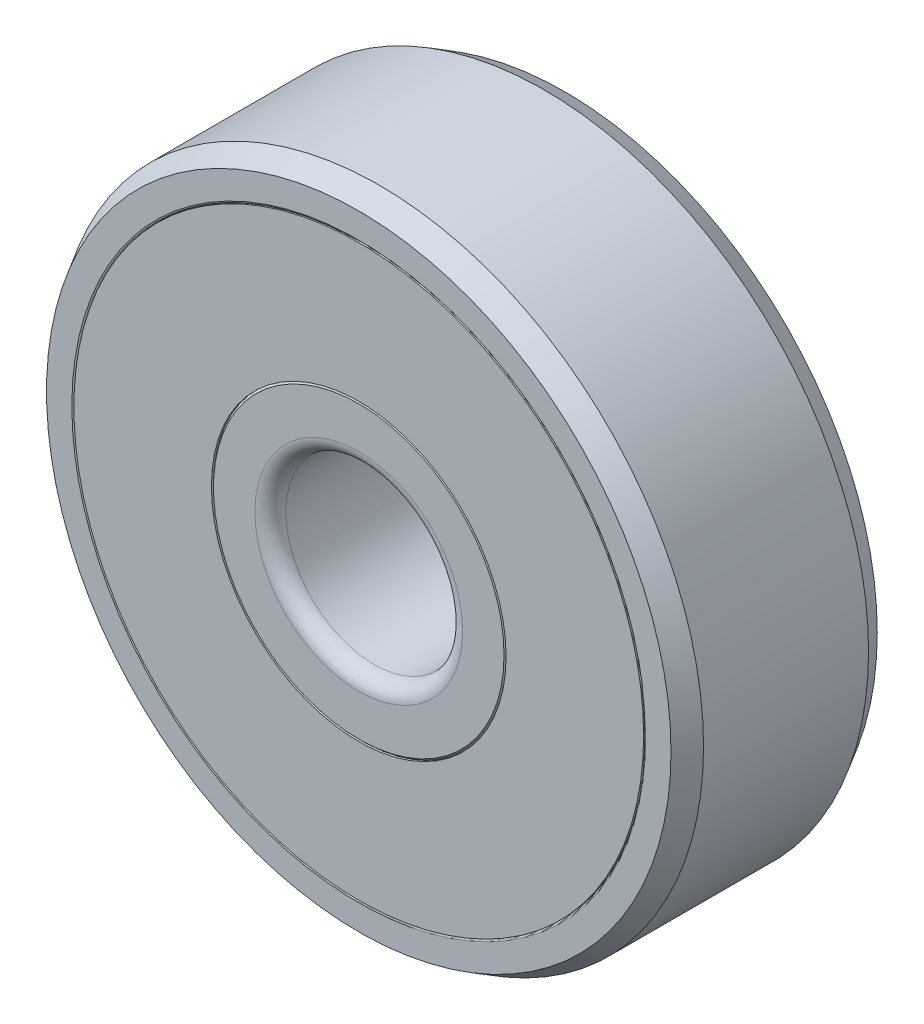
ISO-10303-21;
HEADER;
FILE_DESCRIPTION(('STEP AP214'),'2;1');
FILE_NAME('part.step','',(''),(''),'','','');
FILE_SCHEMA(('AUTOMOTIVE_DESIGN { 1 0 10303 214 1 1 1 1 }'));
ENDSEC;
DATA;
#1=APPLICATION_CONTEXT('core data for automotive mechanical design processes');
#2=APPLICATION_PROTOCOL_DEFINITION('international standard','automotive_design',2000,#1);
#3=PRODUCT_CONTEXT('',#1,'mechanical');
#4=PRODUCT('Part','Part','',(#3));
#5=PRODUCT_RELATED_PRODUCT_CATEGORY('part','',(#4));
#6=PRODUCT_DEFINITION_FORMATION('','',#4);
#7=PRODUCT_DEFINITION_CONTEXT('part definition',#1,'design');
#8=PRODUCT_DEFINITION('design','',#6,#7);
#9=PRODUCT_DEFINITION_SHAPE('','',#8);
#10=(LENGTH_UNIT() NAMED_UNIT(*) SI_UNIT(.MILLI.,.METRE.));
#11=(NAMED_UNIT(*) PLANE_ANGLE_UNIT() SI_UNIT($,.RADIAN.));
#12=(NAMED_UNIT(*) SI_UNIT($,.STERADIAN.) SOLID_ANGLE_UNIT());
#13=UNCERTAINTY_MEASURE_WITH_UNIT(LENGTH_MEASURE(1.E-05),#10,'distance_accuracy_value','');
#14=(GEOMETRIC_REPRESENTATION_CONTEXT(3) GLOBAL_UNCERTAINTY_ASSIGNED_CONTEXT((#13)) GLOBAL_UNIT_ASSIGNED_CONTEXT((#10,
#11,#12)) REPRESENTATION_CONTEXT('',''));
#15=CARTESIAN_POINT('',(0.,0.,0.));
#16=DIRECTION('',(0.,0.,1.));
#17=DIRECTION('',(1.,0.,0.));
#18=AXIS2_PLACEMENT_3D('',#15,#16,#17);
#19=CARTESIAN_POINT('',(5.73343087143216,-4.57225854696412,0.));
#20=DIRECTION('',(-0.781831482468022,0.623489801858743,0.));
#21=DIRECTION('',(0.,0.,1.));
#22=AXIS2_PLACEMENT_3D('',#19,#20,#21);
#23=SPHERICAL_SURFACE('',#22,3.22222222222222);
#24=CARTESIAN_POINT('',(3.21419609459076,-2.56323585208594,0.));
#25=VERTEX_POINT('',#24);
#26=VERTEX_LOOP('',#25);
#27=FACE_BOUND('',#26,.T.);
#28=ADVANCED_FACE('F41',(#27),#23,.T.);
#29=CLOSED_SHELL('',(#28));
#30=MANIFOLD_SOLID_BREP('B2',#29);
#31=CARTESIAN_POINT('',(7.14947135600005,1.63182018234624,0.));
#32=DIRECTION('',(-0.974927912181826,-0.222520933956305,0.));
#33=DIRECTION('',(0.,0.,1.));
#34=AXIS2_PLACEMENT_3D('',#31,#32,#33);
#35=SPHERICAL_SURFACE('',#34,3.22222222222222);
#36=CARTESIAN_POINT('',(4.00803697230306,0.914808284042587,0.));
#37=VERTEX_POINT('',#36);
#38=VERTEX_LOOP('',#37);
#39=FACE_BOUND('',#38,.T.);
#40=ADVANCED_FACE('F61',(#39),#35,.T.);
#41=CLOSED_SHELL('',(#40));
#42=MANIFOLD_SOLID_BREP('B6',#41);
#43=CARTESIAN_POINT('',(3.18181408686214,6.60710503128438,0.));
#44=DIRECTION('',(-0.433883739117565,-0.900968867902416,0.));
#45=DIRECTION('',(0.,0.,1.));
#46=AXIS2_PLACEMENT_3D('',#43,#44,#45);
#47=SPHERICAL_SURFACE('',#46,3.22222222222222);
#48=CARTESIAN_POINT('',(1.78374426081666,3.70398312359882,0.));
#49=VERTEX_POINT('',#48);
#50=VERTEX_LOOP('',#49);
#51=FACE_BOUND('',#50,.T.);
#52=ADVANCED_FACE('F81',(#51),#47,.T.);
#53=CLOSED_SHELL('',(#52));
#54=MANIFOLD_SOLID_BREP('B37',#53);
#55=CARTESIAN_POINT('',(-3.18181408686205,6.60710503128443,0.));
#56=DIRECTION('',(0.433883739117553,-0.900968867902422,0.));
#57=DIRECTION('',(0.,0.,1.));
#58=AXIS2_PLACEMENT_3D('',#55,#56,#57);
#59=SPHERICAL_SURFACE('',#58,3.22222222222222);
#60=CARTESIAN_POINT('',(-1.7837442608166,3.70398312359884,0.));
#61=VERTEX_POINT('',#60);
#62=VERTEX_LOOP('',#61);
#63=FACE_BOUND('',#62,.T.);
#64=ADVANCED_FACE('F101',(#63),#59,.T.);
#65=CLOSED_SHELL('',(#64));
#66=MANIFOLD_SOLID_BREP('B57',#65);
#67=CARTESIAN_POINT('',(-7.14947135600003,1.63182018234633,0.));
#68=DIRECTION('',(0.974927912181823,-0.222520933956318,0.));
#69=DIRECTION('',(0.,0.,1.));
#70=AXIS2_PLACEMENT_3D('',#67,#68,#69);
#71=SPHERICAL_SURFACE('',#70,3.22222222222222);
#72=CARTESIAN_POINT('',(-4.00803697230305,0.914808284042641,0.));
#73=VERTEX_POINT('',#72);
#74=VERTEX_LOOP('',#73);
#75=FACE_BOUND('',#74,.T.);
#76=ADVANCED_FACE('F121',(#75),#71,.T.);
#77=CLOSED_SHELL('',(#76));
#78=MANIFOLD_SOLID_BREP('B77',#77);
#79=CARTESIAN_POINT('',(-5.73343087143223,-4.57225854696403,0.));
#80=DIRECTION('',(0.781831482468031,0.623489801858732,0.));
#81=DIRECTION('',(0.,0.,1.));
#82=AXIS2_PLACEMENT_3D('',#79,#80,#81);
#83=SPHERICAL_SURFACE('',#82,3.22222222222222);
#84=CARTESIAN_POINT('',(-3.21419609459079,-2.5632358520859,0.));
#85=VERTEX_POINT('',#84);
#86=VERTEX_LOOP('',#85);
#87=FACE_BOUND('',#86,.T.);
#88=ADVANCED_FACE('F141',(#87),#83,.T.);
#89=CLOSED_SHELL('',(#88));
#90=MANIFOLD_SOLID_BREP('B97',#89);
#91=CARTESIAN_POINT('',(0.,-7.33333333333333,0.));
#92=DIRECTION('',(0.,1.,0.));
#93=DIRECTION('',(0.,0.,1.));
#94=AXIS2_PLACEMENT_3D('',#91,#92,#93);
#95=SPHERICAL_SURFACE('',#94,3.22222222222222);
#96=CARTESIAN_POINT('',(0.,-4.11111111111111,0.));
#97=VERTEX_POINT('',#96);
#98=VERTEX_LOOP('',#97);
#99=FACE_BOUND('',#98,.T.);
#100=ADVANCED_FACE('F163',(#99),#95,.T.);
#101=CLOSED_SHELL('',(#100));
#102=MANIFOLD_SOLID_BREP('B117',#101);
#103=CARTESIAN_POINT('',(0.,-5.,3.5));
#104=DIRECTION('',(0.,0.,1.));
#105=DIRECTION('',(1.,0.,0.));
#106=AXIS2_PLACEMENT_3D('',#103,#104,#105);
#107=PLANE('',#106);
#108=CARTESIAN_POINT('',(0.,0.,3.5));
#109=DIRECTION('',(0.,0.,1.));
#110=DIRECTION('',(1.,0.,0.));
#111=AXIS2_PLACEMENT_3D('',#108,#109,#110);
#112=CIRCLE('',#111,9.66666666666667);
#113=CARTESIAN_POINT('',(9.66666666666667,0.,3.5));
#114=VERTEX_POINT('',#113);
#115=EDGE_CURVE('E162',#114,#114,#112,.T.);
#116=ORIENTED_EDGE('',*,*,#115,.T.);
#117=EDGE_LOOP('',(#116));
#118=FACE_BOUND('',#117,.T.);
#119=CARTESIAN_POINT('',(0.,0.,3.5));
#120=DIRECTION('',(0.,0.,1.));
#121=DIRECTION('',(1.,0.,0.));
#122=AXIS2_PLACEMENT_3D('',#119,#120,#121);
#123=CIRCLE('',#122,5.);
#124=CARTESIAN_POINT('',(5.,0.,3.5));
#125=VERTEX_POINT('',#124);
#126=EDGE_CURVE('E199',#125,#125,#123,.T.);
#127=ORIENTED_EDGE('',*,*,#126,.F.);
#128=EDGE_LOOP('',(#127));
#129=FACE_BOUND('',#128,.T.);
#130=ADVANCED_FACE('F185',(#118,#129),#107,.T.);
#131=CARTESIAN_POINT('',(0.,0.,3.5));
#132=DIRECTION('',(0.,0.,1.));
#133=DIRECTION('',(1.,0.,0.));
#134=AXIS2_PLACEMENT_3D('',#131,#132,#133);
#135=CYLINDRICAL_SURFACE('',#134,9.66666666666667);
#136=CARTESIAN_POINT('',(0.,0.,3.29166666666667));
#137=DIRECTION('',(0.,0.,1.));
#138=DIRECTION('',(1.,0.,0.));
#139=AXIS2_PLACEMENT_3D('',#136,#137,#138);
#140=CIRCLE('',#139,9.66666666666667);
#141=CARTESIAN_POINT('',(9.66666666666667,0.,3.29166666666667));
#142=VERTEX_POINT('',#141);
#143=EDGE_CURVE('E191',#142,#142,#140,.T.);
#144=ORIENTED_EDGE('',*,*,#143,.T.);
#145=EDGE_LOOP('',(#144));
#146=FACE_BOUND('',#145,.T.);
#147=ORIENTED_EDGE('',*,*,#115,.F.);
#148=EDGE_LOOP('',(#147));
#149=FACE_BOUND('',#148,.T.);
#150=ADVANCED_FACE('F209',(#146,#149),#135,.T.);
#151=CARTESIAN_POINT('',(0.,-5.,3.29166666666667));
#152=DIRECTION('',(0.,0.,-1.));
#153=DIRECTION('',(-1.,0.,0.));
#154=AXIS2_PLACEMENT_3D('',#151,#152,#153);
#155=PLANE('',#154);
#156=CARTESIAN_POINT('',(0.,0.,3.29166666666667));
#157=DIRECTION('',(0.,0.,1.));
#158=DIRECTION('',(1.,0.,0.));
#159=AXIS2_PLACEMENT_3D('',#156,#157,#158);
#160=CIRCLE('',#159,5.);
#161=CARTESIAN_POINT('',(5.,0.,3.29166666666667));
#162=VERTEX_POINT('',#161);
#163=EDGE_CURVE('E195',#162,#162,#160,.T.);
#164=ORIENTED_EDGE('',*,*,#163,.T.);
#165=EDGE_LOOP('',(#164));
#166=FACE_BOUND('',#165,.T.);
#167=ORIENTED_EDGE('',*,*,#143,.F.);
#168=EDGE_LOOP('',(#167));
#169=FACE_BOUND('',#168,.T.);
#170=ADVANCED_FACE('F213',(#166,#169),#155,.T.);
#171=CARTESIAN_POINT('',(0.,0.,3.5));
#172=DIRECTION('',(0.,0.,1.));
#173=DIRECTION('',(1.,0.,0.));
#174=AXIS2_PLACEMENT_3D('',#171,#172,#173);
#175=CYLINDRICAL_SURFACE('',#174,5.);
#176=ORIENTED_EDGE('',*,*,#126,.T.);
#177=EDGE_LOOP('',(#176));
#178=FACE_BOUND('',#177,.T.);
#179=ORIENTED_EDGE('',*,*,#163,.F.);
#180=EDGE_LOOP('',(#179));
#181=FACE_BOUND('',#180,.T.);
#182=ADVANCED_FACE('F205',(#178,#181),#175,.F.);
#183=CLOSED_SHELL('',(#130,#150,#170,#182));
#184=MANIFOLD_SOLID_BREP('B137',#183);
#185=CARTESIAN_POINT('',(0.,0.,2.975));
#186=DIRECTION('',(0.,0.,1.));
#187=DIRECTION('',(1.,0.,0.));
#188=AXIS2_PLACEMENT_3D('',#185,#186,#187);
#189=TOROIDAL_SURFACE('',#188,3.525,0.524999999999999);
#190=CARTESIAN_POINT('',(0.,0.,3.5));
#191=DIRECTION('',(0.,0.,1.));
#192=DIRECTION('',(1.,0.,0.));
#193=AXIS2_PLACEMENT_3D('',#190,#191,#192);
#194=CIRCLE('',#193,3.525);
#195=CARTESIAN_POINT('',(3.525,0.,3.5));
#196=VERTEX_POINT('',#195);
#197=EDGE_CURVE('E184',#196,#196,#194,.T.);
#198=ORIENTED_EDGE('',*,*,#197,.T.);
#199=EDGE_LOOP('',(#198));
#200=FACE_BOUND('',#199,.T.);
#201=CARTESIAN_POINT('',(0.,0.,2.975));
#202=DIRECTION('',(0.,0.,1.));
#203=DIRECTION('',(1.,0.,0.));
#204=AXIS2_PLACEMENT_3D('',#201,#202,#203);
#205=CIRCLE('',#204,3.);
#206=CARTESIAN_POINT('',(3.,0.,2.975));
#207=VERTEX_POINT('',#206);
#208=EDGE_CURVE('E295',#207,#207,#205,.T.);
#209=ORIENTED_EDGE('',*,*,#208,.F.);
#210=EDGE_LOOP('',(#209));
#211=FACE_BOUND('',#210,.T.);
#212=ADVANCED_FACE('F261',(#200,#211),#189,.T.);
#213=CARTESIAN_POINT('',(0.,-4.93,3.5));
#214=DIRECTION('',(0.,0.,1.));
#215=DIRECTION('',(1.,0.,0.));
#216=AXIS2_PLACEMENT_3D('',#213,#214,#215);
#217=PLANE('',#216);
#218=CARTESIAN_POINT('',(0.,0.,3.5));
#219=DIRECTION('',(0.,0.,1.));
#220=DIRECTION('',(1.,0.,0.));
#221=AXIS2_PLACEMENT_3D('',#218,#219,#220);
#222=CIRCLE('',#221,4.93);
#223=CARTESIAN_POINT('',(4.93,0.,3.5));
#224=VERTEX_POINT('',#223);
#225=EDGE_CURVE('E267',#224,#224,#222,.T.);
#226=ORIENTED_EDGE('',*,*,#225,.T.);
#227=EDGE_LOOP('',(#226));
#228=FACE_BOUND('',#227,.T.);
#229=ORIENTED_EDGE('',*,*,#197,.F.);
#230=EDGE_LOOP('',(#229));
#231=FACE_BOUND('',#230,.T.);
#232=ADVANCED_FACE('F303',(#228,#231),#217,.T.);
#233=CARTESIAN_POINT('',(0.,0.,3.5));
#234=DIRECTION('',(0.,0.,-1.));
#235=DIRECTION('',(-1.,0.,0.));
#236=AXIS2_PLACEMENT_3D('',#233,#234,#235);
#237=CONICAL_SURFACE('',#236,4.93,0.785398163397454);
#238=CARTESIAN_POINT('',(0.,0.,3.43));
#239=DIRECTION('',(0.,0.,1.));
#240=DIRECTION('',(1.,0.,0.));
#241=AXIS2_PLACEMENT_3D('',#238,#239,#240);
#242=CIRCLE('',#241,5.);
#243=CARTESIAN_POINT('',(5.,0.,3.43));
#244=VERTEX_POINT('',#243);
#245=EDGE_CURVE('E271',#244,#244,#242,.T.);
#246=ORIENTED_EDGE('',*,*,#245,.T.);
#247=EDGE_LOOP('',(#246));
#248=FACE_BOUND('',#247,.T.);
#249=ORIENTED_EDGE('',*,*,#225,.F.);
#250=EDGE_LOOP('',(#249));
#251=FACE_BOUND('',#250,.T.);
#252=ADVANCED_FACE('F307',(#248,#251),#237,.T.);
#253=CARTESIAN_POINT('',(0.,0.,3.5));
#254=DIRECTION('',(0.,0.,1.));
#255=DIRECTION('',(1.,0.,0.));
#256=AXIS2_PLACEMENT_3D('',#253,#254,#255);
#257=CYLINDRICAL_SURFACE('',#256,5.);
#258=CARTESIAN_POINT('',(0.,0.,2.22222222222222));
#259=DIRECTION('',(0.,0.,1.));
#260=DIRECTION('',(1.,0.,0.));
#261=AXIS2_PLACEMENT_3D('',#258,#259,#260);
#262=CIRCLE('',#261,5.);
#263=CARTESIAN_POINT('',(5.,0.,2.22222222222222));
#264=VERTEX_POINT('',#263);
#265=EDGE_CURVE('E275',#264,#264,#262,.T.);
#266=ORIENTED_EDGE('',*,*,#265,.T.);
#267=EDGE_LOOP('',(#266));
#268=FACE_BOUND('',#267,.T.);
#269=ORIENTED_EDGE('',*,*,#245,.F.);
#270=EDGE_LOOP('',(#269));
#271=FACE_BOUND('',#270,.T.);
#272=ADVANCED_FACE('F311',(#268,#271),#257,.T.);
#273=CARTESIAN_POINT('',(0.,0.,0.));
#274=DIRECTION('',(0.,0.,1.));
#275=DIRECTION('',(1.,0.,0.));
#276=AXIS2_PLACEMENT_3D('',#273,#274,#275);
#277=TOROIDAL_SURFACE('',#276,7.33333333333333,3.22222222222222);
#278=CARTESIAN_POINT('',(0.,0.,-2.22222222222222));
#279=DIRECTION('',(0.,0.,1.));
#280=DIRECTION('',(1.,0.,0.));
#281=AXIS2_PLACEMENT_3D('',#278,#279,#280);
#282=CIRCLE('',#281,5.);
#283=CARTESIAN_POINT('',(5.,0.,-2.22222222222222));
#284=VERTEX_POINT('',#283);
#285=EDGE_CURVE('E280',#284,#284,#282,.T.);
#286=ORIENTED_EDGE('',*,*,#285,.T.);
#287=EDGE_LOOP('',(#286));
#288=FACE_BOUND('',#287,.T.);
#289=ORIENTED_EDGE('',*,*,#265,.F.);
#290=EDGE_LOOP('',(#289));
#291=FACE_BOUND('',#290,.T.);
#292=ADVANCED_FACE('F318',(#288,#291),#277,.F.);
#293=CARTESIAN_POINT('',(0.,0.,3.5));
#294=DIRECTION('',(0.,0.,1.));
#295=DIRECTION('',(1.,0.,0.));
#296=AXIS2_PLACEMENT_3D('',#293,#294,#295);
#297=CYLINDRICAL_SURFACE('',#296,5.);
#298=CARTESIAN_POINT('',(0.,0.,-3.43));
#299=DIRECTION('',(0.,0.,1.));
#300=DIRECTION('',(1.,0.,0.));
#301=AXIS2_PLACEMENT_3D('',#298,#299,#300);
#302=CIRCLE('',#301,5.);
#303=CARTESIAN_POINT('',(5.,0.,-3.43));
#304=VERTEX_POINT('',#303);
#305=EDGE_CURVE('E283',#304,#304,#302,.T.);
#306=ORIENTED_EDGE('',*,*,#305,.T.);
#307=EDGE_LOOP('',(#306));
#308=FACE_BOUND('',#307,.T.);
#309=ORIENTED_EDGE('',*,*,#285,.F.);
#310=EDGE_LOOP('',(#309));
#311=FACE_BOUND('',#310,.T.);
#312=ADVANCED_FACE('F322',(#308,#311),#297,.T.);
#313=CARTESIAN_POINT('',(0.,0.,-3.43));
#314=DIRECTION('',(0.,0.,1.));
#315=DIRECTION('',(1.,0.,0.));
#316=AXIS2_PLACEMENT_3D('',#313,#314,#315);
#317=CONICAL_SURFACE('',#316,5.,0.785398163397454);
#318=CARTESIAN_POINT('',(0.,0.,-3.5));
#319=DIRECTION('',(0.,0.,1.));
#320=DIRECTION('',(1.,0.,0.));
#321=AXIS2_PLACEMENT_3D('',#318,#319,#320);
#322=CIRCLE('',#321,4.93);
#323=CARTESIAN_POINT('',(4.93,0.,-3.5));
#324=VERTEX_POINT('',#323);
#325=EDGE_CURVE('E286',#324,#324,#322,.T.);
#326=ORIENTED_EDGE('',*,*,#325,.T.);
#327=EDGE_LOOP('',(#326));
#328=FACE_BOUND('',#327,.T.);
#329=ORIENTED_EDGE('',*,*,#305,.F.);
#330=EDGE_LOOP('',(#329));
#331=FACE_BOUND('',#330,.T.);
#332=ADVANCED_FACE('F326',(#328,#331),#317,.T.);
#333=CARTESIAN_POINT('',(0.,-4.93,-3.5));
#334=DIRECTION('',(0.,0.,-1.));
#335=DIRECTION('',(-1.,0.,0.));
#336=AXIS2_PLACEMENT_3D('',#333,#334,#335);
#337=PLANE('',#336);
#338=CARTESIAN_POINT('',(0.,0.,-3.5));
#339=DIRECTION('',(0.,0.,1.));
#340=DIRECTION('',(1.,0.,0.));
#341=AXIS2_PLACEMENT_3D('',#338,#339,#340);
#342=CIRCLE('',#341,3.525);
#343=CARTESIAN_POINT('',(3.525,0.,-3.5));
#344=VERTEX_POINT('',#343);
#345=EDGE_CURVE('E289',#344,#344,#342,.T.);
#346=ORIENTED_EDGE('',*,*,#345,.T.);
#347=EDGE_LOOP('',(#346));
#348=FACE_BOUND('',#347,.T.);
#349=ORIENTED_EDGE('',*,*,#325,.F.);
#350=EDGE_LOOP('',(#349));
#351=FACE_BOUND('',#350,.T.);
#352=ADVANCED_FACE('F330',(#348,#351),#337,.T.);
#353=CARTESIAN_POINT('',(0.,0.,-2.975));
#354=DIRECTION('',(0.,0.,1.));
#355=DIRECTION('',(1.,0.,0.));
#356=AXIS2_PLACEMENT_3D('',#353,#354,#355);
#357=TOROIDAL_SURFACE('',#356,3.525,0.524999999999999);
#358=CARTESIAN_POINT('',(0.,0.,-2.975));
#359=DIRECTION('',(0.,0.,1.));
#360=DIRECTION('',(1.,0.,0.));
#361=AXIS2_PLACEMENT_3D('',#358,#359,#360);
#362=CIRCLE('',#361,3.);
#363=CARTESIAN_POINT('',(3.,0.,-2.975));
#364=VERTEX_POINT('',#363);
#365=EDGE_CURVE('E292',#364,#364,#362,.T.);
#366=ORIENTED_EDGE('',*,*,#365,.T.);
#367=EDGE_LOOP('',(#366));
#368=FACE_BOUND('',#367,.T.);
#369=ORIENTED_EDGE('',*,*,#345,.F.);
#370=EDGE_LOOP('',(#369));
#371=FACE_BOUND('',#370,.T.);
#372=ADVANCED_FACE('F334',(#368,#371),#357,.T.);
#373=CARTESIAN_POINT('',(0.,0.,3.5));
#374=DIRECTION('',(0.,0.,1.));
#375=DIRECTION('',(1.,0.,0.));
#376=AXIS2_PLACEMENT_3D('',#373,#374,#375);
#377=CYLINDRICAL_SURFACE('',#376,3.);
#378=ORIENTED_EDGE('',*,*,#208,.T.);
#379=EDGE_LOOP('',(#378));
#380=FACE_BOUND('',#379,.T.);
#381=ORIENTED_EDGE('',*,*,#365,.F.);
#382=EDGE_LOOP('',(#381));
#383=FACE_BOUND('',#382,.T.);
#384=ADVANCED_FACE('F299',(#380,#383),#377,.F.);
#385=CLOSED_SHELL('',(#212,#232,#252,#272,#292,#312,#332,#352,#372,#384));
#386=MANIFOLD_SOLID_BREP('B157',#385);
#387=CARTESIAN_POINT('',(0.,0.,3.5));
#388=DIRECTION('',(0.,0.,-1.));
#389=DIRECTION('',(-1.,0.,0.));
#390=AXIS2_PLACEMENT_3D('',#387,#388,#389);
#391=CONICAL_SURFACE('',#390,10.5958548115673,0.523598775598275);
#392=CARTESIAN_POINT('',(0.,0.,2.8));
#393=DIRECTION('',(0.,0.,1.));
#394=DIRECTION('',(1.,0.,0.));
#395=AXIS2_PLACEMENT_3D('',#392,#393,#394);
#396=CIRCLE('',#395,11.);
#397=CARTESIAN_POINT('',(11.,0.,2.8));
#398=VERTEX_POINT('',#397);
#399=EDGE_CURVE('E260',#398,#398,#396,.T.);
#400=ORIENTED_EDGE('',*,*,#399,.T.);
#401=EDGE_LOOP('',(#400));
#402=FACE_BOUND('',#401,.T.);
#403=CARTESIAN_POINT('',(0.,0.,3.5));
#404=DIRECTION('',(0.,0.,1.));
#405=DIRECTION('',(1.,0.,0.));
#406=AXIS2_PLACEMENT_3D('',#403,#404,#405);
#407=CIRCLE('',#406,10.5958548115673);
#408=CARTESIAN_POINT('',(10.5958548115673,0.,3.5));
#409=VERTEX_POINT('',#408);
#410=EDGE_CURVE('E466',#409,#409,#407,.T.);
#411=ORIENTED_EDGE('',*,*,#410,.F.);
#412=EDGE_LOOP('',(#411));
#413=FACE_BOUND('',#412,.T.);
#414=ADVANCED_FACE('F432',(#402,#413),#391,.T.);
#415=CARTESIAN_POINT('',(0.,0.,3.5));
#416=DIRECTION('',(0.,0.,1.));
#417=DIRECTION('',(1.,0.,0.));
#418=AXIS2_PLACEMENT_3D('',#415,#416,#417);
#419=CYLINDRICAL_SURFACE('',#418,11.);
#420=CARTESIAN_POINT('',(0.,0.,-2.8));
#421=DIRECTION('',(0.,0.,1.));
#422=DIRECTION('',(1.,0.,0.));
#423=AXIS2_PLACEMENT_3D('',#420,#421,#422);
#424=CIRCLE('',#423,11.);
#425=CARTESIAN_POINT('',(11.,0.,-2.8));
#426=VERTEX_POINT('',#425);
#427=EDGE_CURVE('E438',#426,#426,#424,.T.);
#428=ORIENTED_EDGE('',*,*,#427,.T.);
#429=EDGE_LOOP('',(#428));
#430=FACE_BOUND('',#429,.T.);
#431=ORIENTED_EDGE('',*,*,#399,.F.);
#432=EDGE_LOOP('',(#431));
#433=FACE_BOUND('',#432,.T.);
#434=ADVANCED_FACE('F474',(#430,#433),#419,.T.);
#435=CARTESIAN_POINT('',(0.,0.,-2.8));
#436=DIRECTION('',(0.,0.,1.));
#437=DIRECTION('',(1.,0.,0.));
#438=AXIS2_PLACEMENT_3D('',#435,#436,#437);
#439=CONICAL_SURFACE('',#438,11.,0.523598775598275);
#440=CARTESIAN_POINT('',(0.,0.,-3.5));
#441=DIRECTION('',(0.,0.,1.));
#442=DIRECTION('',(1.,0.,0.));
#443=AXIS2_PLACEMENT_3D('',#440,#441,#442);
#444=CIRCLE('',#443,10.5958548115673);
#445=CARTESIAN_POINT('',(10.5958548115673,0.,-3.5));
#446=VERTEX_POINT('',#445);
#447=EDGE_CURVE('E442',#446,#446,#444,.T.);
#448=ORIENTED_EDGE('',*,*,#447,.T.);
#449=EDGE_LOOP('',(#448));
#450=FACE_BOUND('',#449,.T.);
#451=ORIENTED_EDGE('',*,*,#427,.F.);
#452=EDGE_LOOP('',(#451));
#453=FACE_BOUND('',#452,.T.);
#454=ADVANCED_FACE('F478',(#450,#453),#439,.T.);
#455=CARTESIAN_POINT('',(0.,-9.73666666666667,-3.5));
#456=DIRECTION('',(0.,0.,-1.));
#457=DIRECTION('',(-1.,0.,0.));
#458=AXIS2_PLACEMENT_3D('',#455,#456,#457);
#459=PLANE('',#458);
#460=CARTESIAN_POINT('',(0.,0.,-3.5));
#461=DIRECTION('',(0.,0.,1.));
#462=DIRECTION('',(1.,0.,0.));
#463=AXIS2_PLACEMENT_3D('',#460,#461,#462);
#464=CIRCLE('',#463,9.73666666666667);
#465=CARTESIAN_POINT('',(9.73666666666667,0.,-3.5));
#466=VERTEX_POINT('',#465);
#467=EDGE_CURVE('E446',#466,#466,#464,.T.);
#468=ORIENTED_EDGE('',*,*,#467,.T.);
#469=EDGE_LOOP('',(#468));
#470=FACE_BOUND('',#469,.T.);
#471=ORIENTED_EDGE('',*,*,#447,.F.);
#472=EDGE_LOOP('',(#471));
#473=FACE_BOUND('',#472,.T.);
#474=ADVANCED_FACE('F482',(#470,#473),#459,.T.);
#475=CARTESIAN_POINT('',(0.,0.,-3.43));
#476=DIRECTION('',(0.,0.,1.));
#477=DIRECTION('',(1.,0.,0.));
#478=AXIS2_PLACEMENT_3D('',#475,#476,#477);
#479=TOROIDAL_SURFACE('',#478,9.73666666666667,0.070000000000001);
#480=CARTESIAN_POINT('',(0.,0.,-3.43));
#481=DIRECTION('',(0.,0.,1.));
#482=DIRECTION('',(1.,0.,0.));
#483=AXIS2_PLACEMENT_3D('',#480,#481,#482);
#484=CIRCLE('',#483,9.66666666666667);
#485=CARTESIAN_POINT('',(9.66666666666667,0.,-3.43));
#486=VERTEX_POINT('',#485);
#487=EDGE_CURVE('E451',#486,#486,#484,.T.);
#488=ORIENTED_EDGE('',*,*,#487,.T.);
#489=EDGE_LOOP('',(#488));
#490=FACE_BOUND('',#489,.T.);
#491=ORIENTED_EDGE('',*,*,#467,.F.);
#492=EDGE_LOOP('',(#491));
#493=FACE_BOUND('',#492,.T.);
#494=ADVANCED_FACE('F489',(#490,#493),#479,.T.);
#495=CARTESIAN_POINT('',(0.,0.,3.5));
#496=DIRECTION('',(0.,0.,1.));
#497=DIRECTION('',(1.,0.,0.));
#498=AXIS2_PLACEMENT_3D('',#495,#496,#497);
#499=CYLINDRICAL_SURFACE('',#498,9.66666666666667);
#500=CARTESIAN_POINT('',(0.,0.,-2.22222222222222));
#501=DIRECTION('',(0.,0.,1.));
#502=DIRECTION('',(1.,0.,0.));
#503=AXIS2_PLACEMENT_3D('',#500,#501,#502);
#504=CIRCLE('',#503,9.66666666666667);
#505=CARTESIAN_POINT('',(9.66666666666667,0.,-2.22222222222222));
#506=VERTEX_POINT('',#505);
#507=EDGE_CURVE('E454',#506,#506,#504,.T.);
#508=ORIENTED_EDGE('',*,*,#507,.T.);
#509=EDGE_LOOP('',(#508));
#510=FACE_BOUND('',#509,.T.);
#511=ORIENTED_EDGE('',*,*,#487,.F.);
#512=EDGE_LOOP('',(#511));
#513=FACE_BOUND('',#512,.T.);
#514=ADVANCED_FACE('F493',(#510,#513),#499,.F.);
#515=CARTESIAN_POINT('',(0.,0.,0.));
#516=DIRECTION('',(0.,0.,1.));
#517=DIRECTION('',(1.,0.,0.));
#518=AXIS2_PLACEMENT_3D('',#515,#516,#517);
#519=TOROIDAL_SURFACE('',#518,7.33333333333333,3.22222222222222);
#520=CARTESIAN_POINT('',(0.,0.,2.22222222222222));
#521=DIRECTION('',(0.,0.,1.));
#522=DIRECTION('',(1.,0.,0.));
#523=AXIS2_PLACEMENT_3D('',#520,#521,#522);
#524=CIRCLE('',#523,9.66666666666667);
#525=CARTESIAN_POINT('',(9.66666666666667,0.,2.22222222222222));
#526=VERTEX_POINT('',#525);
#527=EDGE_CURVE('E457',#526,#526,#524,.T.);
#528=ORIENTED_EDGE('',*,*,#527,.T.);
#529=EDGE_LOOP('',(#528));
#530=FACE_BOUND('',#529,.T.);
#531=ORIENTED_EDGE('',*,*,#507,.F.);
#532=EDGE_LOOP('',(#531));
#533=FACE_BOUND('',#532,.T.);
#534=ADVANCED_FACE('F497',(#530,#533),#519,.F.);
#535=CARTESIAN_POINT('',(0.,0.,3.5));
#536=DIRECTION('',(0.,0.,1.));
#537=DIRECTION('',(1.,0.,0.));
#538=AXIS2_PLACEMENT_3D('',#535,#536,#537);
#539=CYLINDRICAL_SURFACE('',#538,9.66666666666667);
#540=CARTESIAN_POINT('',(0.,0.,3.43));
#541=DIRECTION('',(0.,0.,1.));
#542=DIRECTION('',(1.,0.,0.));
#543=AXIS2_PLACEMENT_3D('',#540,#541,#542);
#544=CIRCLE('',#543,9.66666666666667);
#545=CARTESIAN_POINT('',(9.66666666666667,0.,3.43));
#546=VERTEX_POINT('',#545);
#547=EDGE_CURVE('E460',#546,#546,#544,.T.);
#548=ORIENTED_EDGE('',*,*,#547,.T.);
#549=EDGE_LOOP('',(#548));
#550=FACE_BOUND('',#549,.T.);
#551=ORIENTED_EDGE('',*,*,#527,.F.);
#552=EDGE_LOOP('',(#551));
#553=FACE_BOUND('',#552,.T.);
#554=ADVANCED_FACE('F501',(#550,#553),#539,.F.);
#555=CARTESIAN_POINT('',(0.,0.,3.43));
#556=DIRECTION('',(0.,0.,1.));
#557=DIRECTION('',(1.,0.,0.));
#558=AXIS2_PLACEMENT_3D('',#555,#556,#557);
#559=TOROIDAL_SURFACE('',#558,9.73666666666667,0.070000000000001);
#560=CARTESIAN_POINT('',(0.,0.,3.5));
#561=DIRECTION('',(0.,0.,1.));
#562=DIRECTION('',(1.,0.,0.));
#563=AXIS2_PLACEMENT_3D('',#560,#561,#562);
#564=CIRCLE('',#563,9.73666666666667);
#565=CARTESIAN_POINT('',(9.73666666666667,0.,3.5));
#566=VERTEX_POINT('',#565);
#567=EDGE_CURVE('E463',#566,#566,#564,.T.);
#568=ORIENTED_EDGE('',*,*,#567,.T.);
#569=EDGE_LOOP('',(#568));
#570=FACE_BOUND('',#569,.T.);
#571=ORIENTED_EDGE('',*,*,#547,.F.);
#572=EDGE_LOOP('',(#571));
#573=FACE_BOUND('',#572,.T.);
#574=ADVANCED_FACE('F505',(#570,#573),#559,.T.);
#575=CARTESIAN_POINT('',(0.,-9.73666666666667,3.5));
#576=DIRECTION('',(0.,0.,1.));
#577=DIRECTION('',(1.,0.,0.));
#578=AXIS2_PLACEMENT_3D('',#575,#576,#577);
#579=PLANE('',#578);
#580=ORIENTED_EDGE('',*,*,#410,.T.);
#581=EDGE_LOOP('',(#580));
#582=FACE_BOUND('',#581,.T.);
#583=ORIENTED_EDGE('',*,*,#567,.F.);
#584=EDGE_LOOP('',(#583));
#585=FACE_BOUND('',#584,.T.);
#586=ADVANCED_FACE('F470',(#582,#585),#579,.T.);
#587=CLOSED_SHELL('',(#414,#434,#454,#474,#494,#514,#534,#554,#574,#586));
#588=MANIFOLD_SOLID_BREP('B179',#587);
#589=ADVANCED_BREP_SHAPE_REPRESENTATION('',(#18,#30,#42,#54,#66,#78,#90,#102,#184,#386,#588),#14);
#590=SHAPE_DEFINITION_REPRESENTATION(#9,#589);
ENDSEC;
END-ISO-10303-21;
